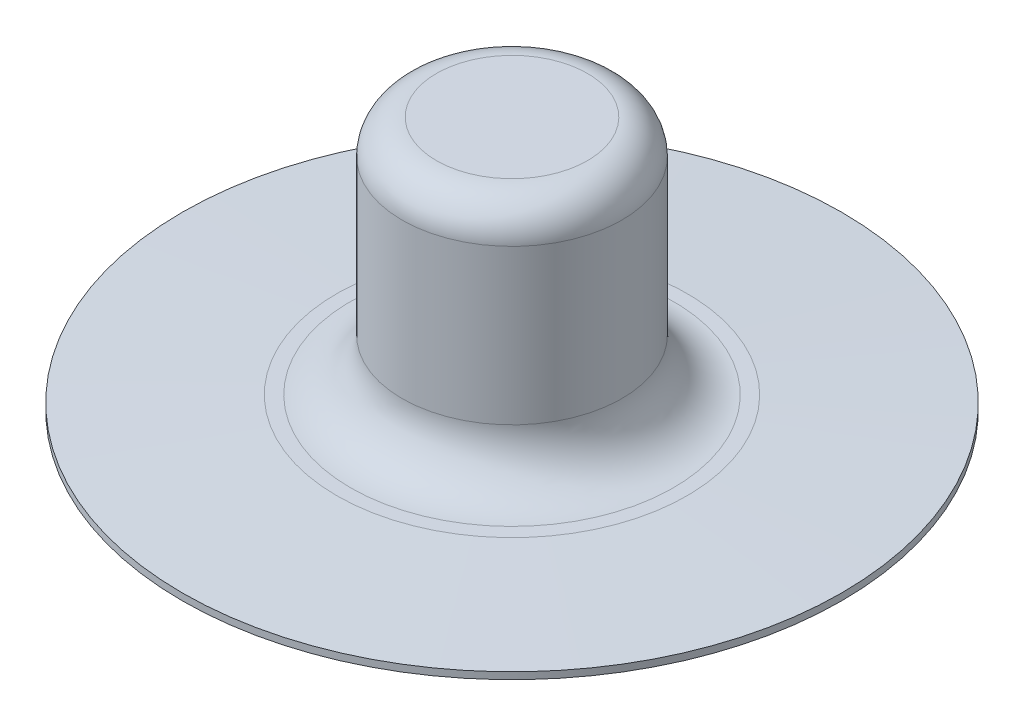
ISO-10303-21;
HEADER;
FILE_DESCRIPTION(('STEP AP214'),'2;1');
FILE_NAME('part.step','',(''),(''),'','','');
FILE_SCHEMA(('AUTOMOTIVE_DESIGN { 1 0 10303 214 1 1 1 1 }'));
ENDSEC;
DATA;
#1=APPLICATION_CONTEXT('core data for automotive mechanical design processes');
#2=APPLICATION_PROTOCOL_DEFINITION('international standard','automotive_design',2000,#1);
#3=PRODUCT_CONTEXT('',#1,'mechanical');
#4=PRODUCT('Part','Part','',(#3));
#5=PRODUCT_RELATED_PRODUCT_CATEGORY('part','',(#4));
#6=PRODUCT_DEFINITION_FORMATION('','',#4);
#7=PRODUCT_DEFINITION_CONTEXT('part definition',#1,'design');
#8=PRODUCT_DEFINITION('design','',#6,#7);
#9=PRODUCT_DEFINITION_SHAPE('','',#8);
#10=(LENGTH_UNIT() NAMED_UNIT(*) SI_UNIT(.MILLI.,.METRE.));
#11=(NAMED_UNIT(*) PLANE_ANGLE_UNIT() SI_UNIT($,.RADIAN.));
#12=(NAMED_UNIT(*) SI_UNIT($,.STERADIAN.) SOLID_ANGLE_UNIT());
#13=UNCERTAINTY_MEASURE_WITH_UNIT(LENGTH_MEASURE(1.E-05),#10,'distance_accuracy_value','');
#14=(GEOMETRIC_REPRESENTATION_CONTEXT(3) GLOBAL_UNCERTAINTY_ASSIGNED_CONTEXT((#13)) GLOBAL_UNIT_ASSIGNED_CONTEXT((#10,
#11,#12)) REPRESENTATION_CONTEXT('',''));
#15=CARTESIAN_POINT('',(0.,0.,0.));
#16=DIRECTION('',(0.,0.,1.));
#17=DIRECTION('',(1.,0.,0.));
#18=AXIS2_PLACEMENT_3D('',#15,#16,#17);
#19=CARTESIAN_POINT('',(0.,0.2,0.));
#20=DIRECTION('',(0.,-1.,0.));
#21=DIRECTION('',(0.,0.,-1.));
#22=AXIS2_PLACEMENT_3D('',#19,#20,#21);
#23=CYLINDRICAL_SURFACE('',#22,4.8);
#24=CARTESIAN_POINT('',(0.,0.1,0.));
#25=DIRECTION('',(0.,1.,0.));
#26=DIRECTION('',(0.,0.,1.));
#27=AXIS2_PLACEMENT_3D('',#24,#25,#26);
#28=CIRCLE('',#27,4.8);
#29=CARTESIAN_POINT('',(0.,0.1,4.8));
#30=VERTEX_POINT('',#29);
#31=EDGE_CURVE('E10',#30,#30,#28,.F.);
#32=ORIENTED_EDGE('',*,*,#31,.T.);
#33=EDGE_LOOP('',(#32));
#34=FACE_BOUND('',#33,.T.);
#35=CARTESIAN_POINT('',(0.,0.,0.));
#36=DIRECTION('',(0.,1.,0.));
#37=DIRECTION('',(0.,0.,1.));
#38=AXIS2_PLACEMENT_3D('',#35,#36,#37);
#39=CIRCLE('',#38,4.8);
#40=CARTESIAN_POINT('',(0.,0.,4.8));
#41=VERTEX_POINT('',#40);
#42=EDGE_CURVE('E83',#41,#41,#39,.T.);
#43=ORIENTED_EDGE('',*,*,#42,.T.);
#44=EDGE_LOOP('',(#43));
#45=FACE_BOUND('',#44,.T.);
#46=ADVANCED_FACE('F42',(#34,#45),#23,.T.);
#47=CARTESIAN_POINT('',(0.,0.2,0.));
#48=DIRECTION('',(0.,1.,0.));
#49=DIRECTION('',(0.,0.,1.));
#50=AXIS2_PLACEMENT_3D('',#47,#48,#49);
#51=PLANE('',#50);
#52=CARTESIAN_POINT('',(0.,0.2,0.));
#53=DIRECTION('',(0.,1.,0.));
#54=DIRECTION('',(0.,0.,1.));
#55=AXIS2_PLACEMENT_3D('',#52,#53,#54);
#56=CIRCLE('',#55,2.54999999999982);
#57=CARTESIAN_POINT('',(0.,0.2,2.54999999999982));
#58=VERTEX_POINT('',#57);
#59=EDGE_CURVE('E51',#58,#58,#56,.T.);
#60=ORIENTED_EDGE('',*,*,#59,.T.);
#61=EDGE_LOOP('',(#60));
#62=FACE_BOUND('',#61,.T.);
#63=CARTESIAN_POINT('',(0.,0.2,0.));
#64=DIRECTION('',(0.,1.,0.));
#65=DIRECTION('',(0.,0.,1.));
#66=AXIS2_PLACEMENT_3D('',#63,#64,#65);
#67=CIRCLE('',#66,2.35);
#68=CARTESIAN_POINT('',(0.,0.2,2.35));
#69=VERTEX_POINT('',#68);
#70=EDGE_CURVE('E67',#69,#69,#67,.F.);
#71=ORIENTED_EDGE('',*,*,#70,.T.);
#72=EDGE_LOOP('',(#71));
#73=FACE_BOUND('',#72,.T.);
#74=ADVANCED_FACE('F110',(#62,#73),#51,.T.);
#75=CARTESIAN_POINT('',(0.,0.,0.));
#76=DIRECTION('',(0.,1.,0.));
#77=DIRECTION('',(0.,0.,1.));
#78=AXIS2_PLACEMENT_3D('',#75,#76,#77);
#79=PLANE('',#78);
#80=CARTESIAN_POINT('',(0.,0.,0.));
#81=DIRECTION('',(0.,1.,0.));
#82=DIRECTION('',(0.,0.,1.));
#83=AXIS2_PLACEMENT_3D('',#80,#81,#82);
#84=CIRCLE('',#83,2.15);
#85=CARTESIAN_POINT('',(0.,0.,2.15));
#86=VERTEX_POINT('',#85);
#87=EDGE_CURVE('E56',#86,#86,#84,.T.);
#88=ORIENTED_EDGE('',*,*,#87,.T.);
#89=EDGE_LOOP('',(#88));
#90=FACE_BOUND('',#89,.T.);
#91=ORIENTED_EDGE('',*,*,#42,.F.);
#92=EDGE_LOOP('',(#91));
#93=FACE_BOUND('',#92,.T.);
#94=ADVANCED_FACE('F116',(#90,#93),#79,.F.);
#95=CARTESIAN_POINT('',(0.,3.7,0.));
#96=DIRECTION('',(0.,-1.,0.));
#97=DIRECTION('',(0.,0.,-1.));
#98=AXIS2_PLACEMENT_3D('',#95,#96,#97);
#99=CYLINDRICAL_SURFACE('',#98,1.6);
#100=CARTESIAN_POINT('',(0.,0.95,0.));
#101=DIRECTION('',(0.,1.,0.));
#102=DIRECTION('',(0.,0.,1.));
#103=AXIS2_PLACEMENT_3D('',#100,#101,#102);
#104=CIRCLE('',#103,1.6);
#105=CARTESIAN_POINT('',(0.,0.95,1.6));
#106=VERTEX_POINT('',#105);
#107=EDGE_CURVE('E71',#106,#106,#104,.T.);
#108=ORIENTED_EDGE('',*,*,#107,.T.);
#109=EDGE_LOOP('',(#108));
#110=FACE_BOUND('',#109,.T.);
#111=CARTESIAN_POINT('',(0.,3.2,0.));
#112=DIRECTION('',(0.,1.,0.));
#113=DIRECTION('',(0.,0.,1.));
#114=AXIS2_PLACEMENT_3D('',#111,#112,#113);
#115=CIRCLE('',#114,1.6);
#116=CARTESIAN_POINT('',(0.,3.2,1.6));
#117=VERTEX_POINT('',#116);
#118=EDGE_CURVE('E75',#117,#117,#115,.F.);
#119=ORIENTED_EDGE('',*,*,#118,.T.);
#120=EDGE_LOOP('',(#119));
#121=FACE_BOUND('',#120,.T.);
#122=ADVANCED_FACE('F135',(#110,#121),#99,.T.);
#123=CARTESIAN_POINT('',(0.,3.7,0.));
#124=DIRECTION('',(0.,1.,0.));
#125=DIRECTION('',(0.,0.,1.));
#126=AXIS2_PLACEMENT_3D('',#123,#124,#125);
#127=PLANE('',#126);
#128=CARTESIAN_POINT('',(0.,3.7,0.));
#129=DIRECTION('',(0.,1.,0.));
#130=DIRECTION('',(0.,0.,1.));
#131=AXIS2_PLACEMENT_3D('',#128,#129,#130);
#132=CIRCLE('',#131,1.1);
#133=CARTESIAN_POINT('',(0.,3.7,1.1));
#134=VERTEX_POINT('',#133);
#135=EDGE_CURVE('E79',#134,#134,#132,.T.);
#136=ORIENTED_EDGE('',*,*,#135,.T.);
#137=EDGE_LOOP('',(#136));
#138=FACE_BOUND('',#137,.T.);
#139=ADVANCED_FACE('F122',(#138),#127,.T.);
#140=CARTESIAN_POINT('',(0.,3.2,0.));
#141=DIRECTION('',(0.,1.,0.));
#142=DIRECTION('',(0.,0.,1.));
#143=AXIS2_PLACEMENT_3D('',#140,#141,#142);
#144=TOROIDAL_SURFACE('',#143,1.1,0.5);
#145=ORIENTED_EDGE('',*,*,#118,.F.);
#146=EDGE_LOOP('',(#145));
#147=FACE_BOUND('',#146,.T.);
#148=ORIENTED_EDGE('',*,*,#135,.F.);
#149=EDGE_LOOP('',(#148));
#150=FACE_BOUND('',#149,.T.);
#151=ADVANCED_FACE('F105',(#147,#150),#144,.T.);
#152=CARTESIAN_POINT('',(0.,0.95,0.));
#153=DIRECTION('',(0.,1.,0.));
#154=DIRECTION('',(0.,0.,1.));
#155=AXIS2_PLACEMENT_3D('',#152,#153,#154);
#156=TOROIDAL_SURFACE('',#155,2.35,0.75);
#157=ORIENTED_EDGE('',*,*,#70,.F.);
#158=EDGE_LOOP('',(#157));
#159=FACE_BOUND('',#158,.T.);
#160=ORIENTED_EDGE('',*,*,#107,.F.);
#161=EDGE_LOOP('',(#160));
#162=FACE_BOUND('',#161,.T.);
#163=ADVANCED_FACE('F96',(#159,#162),#156,.F.);
#164=CARTESIAN_POINT('',(0.,3.,0.));
#165=DIRECTION('',(0.,-1.,0.));
#166=DIRECTION('',(0.,0.,-1.));
#167=AXIS2_PLACEMENT_3D('',#164,#165,#166);
#168=CYLINDRICAL_SURFACE('',#167,1.15);
#169=CARTESIAN_POINT('',(0.,1.,0.));
#170=DIRECTION('',(0.,1.,0.));
#171=DIRECTION('',(0.,0.,1.));
#172=AXIS2_PLACEMENT_3D('',#169,#170,#171);
#173=CIRCLE('',#172,1.15);
#174=CARTESIAN_POINT('',(0.,1.,1.15));
#175=VERTEX_POINT('',#174);
#176=EDGE_CURVE('E61',#175,#175,#173,.F.);
#177=ORIENTED_EDGE('',*,*,#176,.T.);
#178=EDGE_LOOP('',(#177));
#179=FACE_BOUND('',#178,.T.);
#180=CARTESIAN_POINT('',(0.,3.,0.));
#181=DIRECTION('',(0.,-1.,0.));
#182=DIRECTION('',(0.,0.,-1.));
#183=AXIS2_PLACEMENT_3D('',#180,#181,#182);
#184=CIRCLE('',#183,1.15);
#185=CARTESIAN_POINT('',(0.,3.,-1.15));
#186=VERTEX_POINT('',#185);
#187=EDGE_CURVE('E87',#186,#186,#184,.T.);
#188=ORIENTED_EDGE('',*,*,#187,.F.);
#189=EDGE_LOOP('',(#188));
#190=FACE_BOUND('',#189,.T.);
#191=ADVANCED_FACE('F94',(#179,#190),#168,.F.);
#192=CARTESIAN_POINT('',(0.,3.,0.));
#193=DIRECTION('',(0.,-1.,0.));
#194=DIRECTION('',(0.,0.,-1.));
#195=AXIS2_PLACEMENT_3D('',#192,#193,#194);
#196=PLANE('',#195);
#197=ORIENTED_EDGE('',*,*,#187,.T.);
#198=EDGE_LOOP('',(#197));
#199=FACE_BOUND('',#198,.T.);
#200=ADVANCED_FACE('F92',(#199),#196,.T.);
#201=CARTESIAN_POINT('',(0.,1.,0.));
#202=DIRECTION('',(0.,1.,0.));
#203=DIRECTION('',(0.,0.,1.));
#204=AXIS2_PLACEMENT_3D('',#201,#202,#203);
#205=TOROIDAL_SURFACE('',#204,2.15,1.);
#206=ORIENTED_EDGE('',*,*,#87,.F.);
#207=EDGE_LOOP('',(#206));
#208=FACE_BOUND('',#207,.T.);
#209=ORIENTED_EDGE('',*,*,#176,.F.);
#210=EDGE_LOOP('',(#209));
#211=FACE_BOUND('',#210,.T.);
#212=ADVANCED_FACE('F103',(#208,#211),#205,.T.);
#213=CARTESIAN_POINT('',(0.,0.2,0.));
#214=DIRECTION('',(0.,-1.,0.));
#215=DIRECTION('',(0.,0.,-1.));
#216=AXIS2_PLACEMENT_3D('',#213,#214,#215);
#217=CONICAL_SURFACE('',#216,2.54999999999982,1.52638111154799);
#218=ORIENTED_EDGE('',*,*,#31,.F.);
#219=EDGE_LOOP('',(#218));
#220=FACE_BOUND('',#219,.T.);
#221=ORIENTED_EDGE('',*,*,#59,.F.);
#222=EDGE_LOOP('',(#221));
#223=FACE_BOUND('',#222,.T.);
#224=ADVANCED_FACE('F45',(#220,#223),#217,.T.);
#225=CLOSED_SHELL('',(#46,#74,#94,#122,#139,#151,#163,#191,#200,#212,#224));
#226=MANIFOLD_SOLID_BREP('B2',#225);
#227=ADVANCED_BREP_SHAPE_REPRESENTATION('',(#18,#226),#14);
#228=SHAPE_DEFINITION_REPRESENTATION(#9,#227);
ENDSEC;
END-ISO-10303-21;
